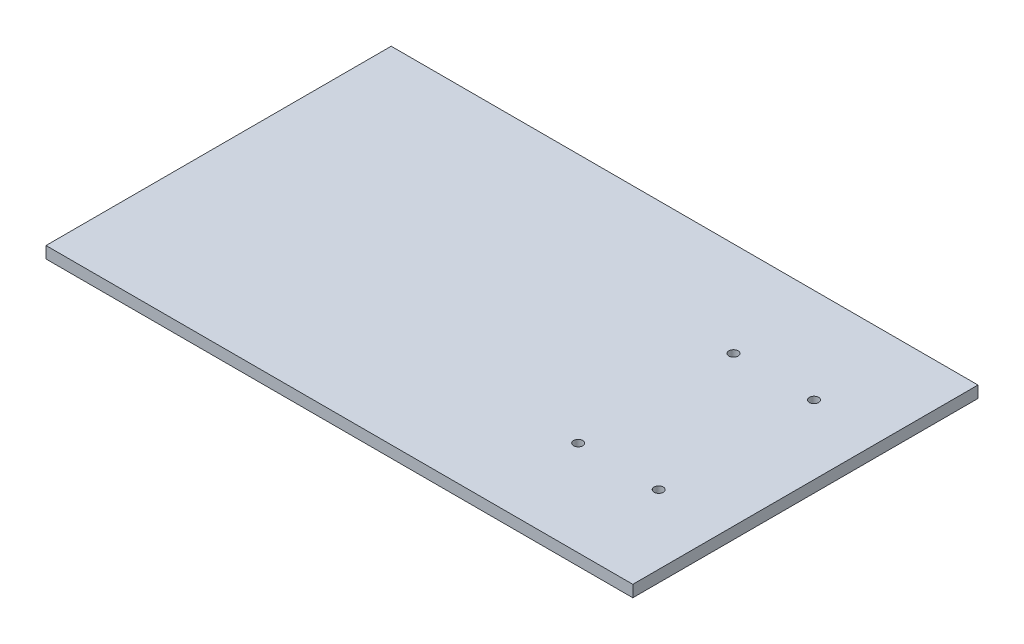
ISO-10303-21;
HEADER;
FILE_DESCRIPTION(('STEP AP214'),'2;1');
FILE_NAME('part.step','',(''),(''),'','','');
FILE_SCHEMA(('AUTOMOTIVE_DESIGN { 1 0 10303 214 1 1 1 1 }'));
ENDSEC;
DATA;
#1=APPLICATION_CONTEXT('core data for automotive mechanical design processes');
#2=APPLICATION_PROTOCOL_DEFINITION('international standard','automotive_design',2000,#1);
#3=PRODUCT_CONTEXT('',#1,'mechanical');
#4=PRODUCT('Part','Part','',(#3));
#5=PRODUCT_RELATED_PRODUCT_CATEGORY('part','',(#4));
#6=PRODUCT_DEFINITION_FORMATION('','',#4);
#7=PRODUCT_DEFINITION_CONTEXT('part definition',#1,'design');
#8=PRODUCT_DEFINITION('design','',#6,#7);
#9=PRODUCT_DEFINITION_SHAPE('','',#8);
#10=(LENGTH_UNIT() NAMED_UNIT(*) SI_UNIT(.MILLI.,.METRE.));
#11=(NAMED_UNIT(*) PLANE_ANGLE_UNIT() SI_UNIT($,.RADIAN.));
#12=(NAMED_UNIT(*) SI_UNIT($,.STERADIAN.) SOLID_ANGLE_UNIT());
#13=UNCERTAINTY_MEASURE_WITH_UNIT(LENGTH_MEASURE(1.E-05),#10,'distance_accuracy_value','');
#14=(GEOMETRIC_REPRESENTATION_CONTEXT(3) GLOBAL_UNCERTAINTY_ASSIGNED_CONTEXT((#13)) GLOBAL_UNIT_ASSIGNED_CONTEXT((#10,
#11,#12)) REPRESENTATION_CONTEXT('',''));
#15=CARTESIAN_POINT('',(0.,0.,0.));
#16=DIRECTION('',(0.,0.,1.));
#17=DIRECTION('',(1.,0.,0.));
#18=AXIS2_PLACEMENT_3D('',#15,#16,#17);
#19=CARTESIAN_POINT('',(0.,10.16,0.));
#20=DIRECTION('',(1.,0.,0.));
#21=DIRECTION('',(0.,0.,-1.));
#22=AXIS2_PLACEMENT_3D('',#19,#20,#21);
#23=PLANE('',#22);
#24=DIRECTION('',(0.,0.,1.));
#25=VECTOR('',#24,1.);
#26=CARTESIAN_POINT('',(0.,0.,0.));
#27=LINE('',#26,#25);
#28=CARTESIAN_POINT('',(0.,0.,-300.));
#29=VERTEX_POINT('',#28);
#30=CARTESIAN_POINT('',(0.,0.,0.));
#31=VERTEX_POINT('',#30);
#32=EDGE_CURVE('E110',#29,#31,#27,.T.);
#33=ORIENTED_EDGE('',*,*,#32,.T.);
#34=DIRECTION('',(0.,-1.,0.));
#35=VECTOR('',#34,1.);
#36=CARTESIAN_POINT('',(0.,10.16,0.));
#37=LINE('',#36,#35);
#38=CARTESIAN_POINT('',(0.,10.16,0.));
#39=VERTEX_POINT('',#38);
#40=EDGE_CURVE('E11',#39,#31,#37,.T.);
#41=ORIENTED_EDGE('',*,*,#40,.F.);
#42=DIRECTION('',(0.,0.,1.));
#43=VECTOR('',#42,1.);
#44=CARTESIAN_POINT('',(0.,10.16,0.));
#45=LINE('',#44,#43);
#46=CARTESIAN_POINT('',(0.,10.16,-300.));
#47=VERTEX_POINT('',#46);
#48=EDGE_CURVE('E94',#47,#39,#45,.T.);
#49=ORIENTED_EDGE('',*,*,#48,.F.);
#50=DIRECTION('',(0.,-1.,0.));
#51=VECTOR('',#50,1.);
#52=CARTESIAN_POINT('',(0.,10.16,-300.));
#53=LINE('',#52,#51);
#54=EDGE_CURVE('E106',#47,#29,#53,.T.);
#55=ORIENTED_EDGE('',*,*,#54,.T.);
#56=EDGE_LOOP('',(#33,#41,#49,#55));
#57=FACE_BOUND('',#56,.T.);
#58=ADVANCED_FACE('F42',(#57),#23,.F.);
#59=CARTESIAN_POINT('',(0.,10.16,0.));
#60=DIRECTION('',(0.,0.,-1.));
#61=DIRECTION('',(-1.,0.,0.));
#62=AXIS2_PLACEMENT_3D('',#59,#60,#61);
#63=PLANE('',#62);
#64=DIRECTION('',(1.,0.,0.));
#65=VECTOR('',#64,1.);
#66=CARTESIAN_POINT('',(0.,0.,0.));
#67=LINE('',#66,#65);
#68=CARTESIAN_POINT('',(510.,0.,0.));
#69=VERTEX_POINT('',#68);
#70=EDGE_CURVE('E99',#31,#69,#67,.T.);
#71=ORIENTED_EDGE('',*,*,#70,.T.);
#72=DIRECTION('',(0.,-1.,0.));
#73=VECTOR('',#72,1.);
#74=CARTESIAN_POINT('',(510.,10.16,0.));
#75=LINE('',#74,#73);
#76=CARTESIAN_POINT('',(510.,10.16,0.));
#77=VERTEX_POINT('',#76);
#78=EDGE_CURVE('E51',#77,#69,#75,.T.);
#79=ORIENTED_EDGE('',*,*,#78,.F.);
#80=DIRECTION('',(1.,0.,0.));
#81=VECTOR('',#80,1.);
#82=CARTESIAN_POINT('',(0.,10.16,0.));
#83=LINE('',#82,#81);
#84=EDGE_CURVE('E89',#39,#77,#83,.T.);
#85=ORIENTED_EDGE('',*,*,#84,.F.);
#86=ORIENTED_EDGE('',*,*,#40,.T.);
#87=EDGE_LOOP('',(#71,#79,#85,#86));
#88=FACE_BOUND('',#87,.T.);
#89=ADVANCED_FACE('F98',(#88),#63,.F.);
#90=CARTESIAN_POINT('',(510.,10.16,0.));
#91=DIRECTION('',(-1.,0.,0.));
#92=DIRECTION('',(0.,0.,1.));
#93=AXIS2_PLACEMENT_3D('',#90,#91,#92);
#94=PLANE('',#93);
#95=DIRECTION('',(0.,0.,-1.));
#96=VECTOR('',#95,1.);
#97=CARTESIAN_POINT('',(510.,0.,0.));
#98=LINE('',#97,#96);
#99=CARTESIAN_POINT('',(510.,0.,-300.));
#100=VERTEX_POINT('',#99);
#101=EDGE_CURVE('E76',#69,#100,#98,.T.);
#102=ORIENTED_EDGE('',*,*,#101,.T.);
#103=DIRECTION('',(0.,-1.,0.));
#104=VECTOR('',#103,1.);
#105=CARTESIAN_POINT('',(510.,10.16,-300.));
#106=LINE('',#105,#104);
#107=CARTESIAN_POINT('',(510.,10.16,-300.));
#108=VERTEX_POINT('',#107);
#109=EDGE_CURVE('E101',#108,#100,#106,.T.);
#110=ORIENTED_EDGE('',*,*,#109,.F.);
#111=DIRECTION('',(0.,0.,-1.));
#112=VECTOR('',#111,1.);
#113=CARTESIAN_POINT('',(510.,10.16,0.));
#114=LINE('',#113,#112);
#115=EDGE_CURVE('E92',#77,#108,#114,.T.);
#116=ORIENTED_EDGE('',*,*,#115,.F.);
#117=ORIENTED_EDGE('',*,*,#78,.T.);
#118=EDGE_LOOP('',(#102,#110,#116,#117));
#119=FACE_BOUND('',#118,.T.);
#120=ADVANCED_FACE('F102',(#119),#94,.F.);
#121=CARTESIAN_POINT('',(0.,10.16,-300.));
#122=DIRECTION('',(0.,0.,1.));
#123=DIRECTION('',(1.,0.,0.));
#124=AXIS2_PLACEMENT_3D('',#121,#122,#123);
#125=PLANE('',#124);
#126=DIRECTION('',(-1.,0.,0.));
#127=VECTOR('',#126,1.);
#128=CARTESIAN_POINT('',(0.,0.,-300.));
#129=LINE('',#128,#127);
#130=EDGE_CURVE('E82',#100,#29,#129,.T.);
#131=ORIENTED_EDGE('',*,*,#130,.T.);
#132=ORIENTED_EDGE('',*,*,#54,.F.);
#133=DIRECTION('',(-1.,0.,0.));
#134=VECTOR('',#133,1.);
#135=CARTESIAN_POINT('',(0.,10.16,-300.));
#136=LINE('',#135,#134);
#137=EDGE_CURVE('E59',#108,#47,#136,.T.);
#138=ORIENTED_EDGE('',*,*,#137,.F.);
#139=ORIENTED_EDGE('',*,*,#109,.T.);
#140=EDGE_LOOP('',(#131,#132,#138,#139));
#141=FACE_BOUND('',#140,.T.);
#142=ADVANCED_FACE('F124',(#141),#125,.F.);
#143=CARTESIAN_POINT('',(0.,10.16,0.));
#144=DIRECTION('',(0.,-1.,0.));
#145=DIRECTION('',(0.,0.,-1.));
#146=AXIS2_PLACEMENT_3D('',#143,#144,#145);
#147=PLANE('',#146);
#148=CARTESIAN_POINT('',(450.,10.16,-217.5));
#149=DIRECTION('',(0.,-1.,0.));
#150=DIRECTION('',(0.,0.,-1.));
#151=AXIS2_PLACEMENT_3D('',#148,#149,#150);
#152=CIRCLE('',#151,3.99999999999999);
#153=CARTESIAN_POINT('',(450.,10.16,-221.5));
#154=VERTEX_POINT('',#153);
#155=EDGE_CURVE('E139',#154,#154,#152,.T.);
#156=ORIENTED_EDGE('',*,*,#155,.T.);
#157=EDGE_LOOP('',(#156));
#158=FACE_BOUND('',#157,.T.);
#159=CARTESIAN_POINT('',(450.,10.16,-82.5));
#160=DIRECTION('',(0.,-1.,0.));
#161=DIRECTION('',(0.,0.,-1.));
#162=AXIS2_PLACEMENT_3D('',#159,#160,#161);
#163=CIRCLE('',#162,3.99999999999999);
#164=CARTESIAN_POINT('',(450.,10.16,-86.5));
#165=VERTEX_POINT('',#164);
#166=EDGE_CURVE('E147',#165,#165,#163,.T.);
#167=ORIENTED_EDGE('',*,*,#166,.T.);
#168=EDGE_LOOP('',(#167));
#169=FACE_BOUND('',#168,.T.);
#170=CARTESIAN_POINT('',(380.,10.16,-82.5000000000002));
#171=DIRECTION('',(0.,-1.,0.));
#172=DIRECTION('',(0.,0.,-1.));
#173=AXIS2_PLACEMENT_3D('',#170,#171,#172);
#174=CIRCLE('',#173,3.99999999999999);
#175=CARTESIAN_POINT('',(380.,10.16,-86.5000000000002));
#176=VERTEX_POINT('',#175);
#177=EDGE_CURVE('E155',#176,#176,#174,.T.);
#178=ORIENTED_EDGE('',*,*,#177,.T.);
#179=EDGE_LOOP('',(#178));
#180=FACE_BOUND('',#179,.T.);
#181=CARTESIAN_POINT('',(380.,10.16,-217.5));
#182=DIRECTION('',(0.,-1.,0.));
#183=DIRECTION('',(0.,0.,-1.));
#184=AXIS2_PLACEMENT_3D('',#181,#182,#183);
#185=CIRCLE('',#184,3.99999999999999);
#186=CARTESIAN_POINT('',(380.,10.16,-221.5));
#187=VERTEX_POINT('',#186);
#188=EDGE_CURVE('E114',#187,#187,#185,.T.);
#189=ORIENTED_EDGE('',*,*,#188,.T.);
#190=EDGE_LOOP('',(#189));
#191=FACE_BOUND('',#190,.T.);
#192=ORIENTED_EDGE('',*,*,#48,.T.);
#193=ORIENTED_EDGE('',*,*,#84,.T.);
#194=ORIENTED_EDGE('',*,*,#115,.T.);
#195=ORIENTED_EDGE('',*,*,#137,.T.);
#196=EDGE_LOOP('',(#192,#193,#194,#195));
#197=FACE_BOUND('',#196,.T.);
#198=ADVANCED_FACE('F90',(#158,#169,#180,#191,#197),#147,.F.);
#199=CARTESIAN_POINT('',(0.,0.,0.));
#200=DIRECTION('',(0.,-1.,0.));
#201=DIRECTION('',(0.,0.,-1.));
#202=AXIS2_PLACEMENT_3D('',#199,#200,#201);
#203=PLANE('',#202);
#204=CARTESIAN_POINT('',(450.,0.,-217.5));
#205=DIRECTION('',(0.,-1.,0.));
#206=DIRECTION('',(0.,0.,-1.));
#207=AXIS2_PLACEMENT_3D('',#204,#205,#206);
#208=CIRCLE('',#207,3.99999999999999);
#209=CARTESIAN_POINT('',(450.,0.,-221.5));
#210=VERTEX_POINT('',#209);
#211=EDGE_CURVE('E143',#210,#210,#208,.T.);
#212=ORIENTED_EDGE('',*,*,#211,.F.);
#213=EDGE_LOOP('',(#212));
#214=FACE_BOUND('',#213,.T.);
#215=CARTESIAN_POINT('',(450.,0.,-82.5));
#216=DIRECTION('',(0.,-1.,0.));
#217=DIRECTION('',(0.,0.,-1.));
#218=AXIS2_PLACEMENT_3D('',#215,#216,#217);
#219=CIRCLE('',#218,3.99999999999999);
#220=CARTESIAN_POINT('',(450.,0.,-86.5));
#221=VERTEX_POINT('',#220);
#222=EDGE_CURVE('E151',#221,#221,#219,.T.);
#223=ORIENTED_EDGE('',*,*,#222,.F.);
#224=EDGE_LOOP('',(#223));
#225=FACE_BOUND('',#224,.T.);
#226=CARTESIAN_POINT('',(380.,0.,-82.5000000000002));
#227=DIRECTION('',(0.,-1.,0.));
#228=DIRECTION('',(0.,0.,-1.));
#229=AXIS2_PLACEMENT_3D('',#226,#227,#228);
#230=CIRCLE('',#229,3.99999999999999);
#231=CARTESIAN_POINT('',(380.,0.,-86.5000000000002));
#232=VERTEX_POINT('',#231);
#233=EDGE_CURVE('E135',#232,#232,#230,.T.);
#234=ORIENTED_EDGE('',*,*,#233,.F.);
#235=EDGE_LOOP('',(#234));
#236=FACE_BOUND('',#235,.T.);
#237=CARTESIAN_POINT('',(380.,0.,-217.5));
#238=DIRECTION('',(0.,-1.,0.));
#239=DIRECTION('',(0.,0.,-1.));
#240=AXIS2_PLACEMENT_3D('',#237,#238,#239);
#241=CIRCLE('',#240,3.99999999999999);
#242=CARTESIAN_POINT('',(380.,0.,-221.5));
#243=VERTEX_POINT('',#242);
#244=EDGE_CURVE('E131',#243,#243,#241,.T.);
#245=ORIENTED_EDGE('',*,*,#244,.F.);
#246=EDGE_LOOP('',(#245));
#247=FACE_BOUND('',#246,.T.);
#248=ORIENTED_EDGE('',*,*,#32,.F.);
#249=ORIENTED_EDGE('',*,*,#130,.F.);
#250=ORIENTED_EDGE('',*,*,#101,.F.);
#251=ORIENTED_EDGE('',*,*,#70,.F.);
#252=EDGE_LOOP('',(#248,#249,#250,#251));
#253=FACE_BOUND('',#252,.T.);
#254=ADVANCED_FACE('F127',(#214,#225,#236,#247,#253),#203,.T.);
#255=CARTESIAN_POINT('',(380.,10.16,-217.5));
#256=DIRECTION('',(0.,-1.,0.));
#257=DIRECTION('',(0.,0.,-1.));
#258=AXIS2_PLACEMENT_3D('',#255,#256,#257);
#259=CYLINDRICAL_SURFACE('',#258,3.99999999999999);
#260=ORIENTED_EDGE('',*,*,#188,.F.);
#261=EDGE_LOOP('',(#260));
#262=FACE_BOUND('',#261,.T.);
#263=ORIENTED_EDGE('',*,*,#244,.T.);
#264=EDGE_LOOP('',(#263));
#265=FACE_BOUND('',#264,.T.);
#266=ADVANCED_FACE('F167',(#262,#265),#259,.F.);
#267=CARTESIAN_POINT('',(380.,10.16,-82.5000000000002));
#268=DIRECTION('',(0.,-1.,0.));
#269=DIRECTION('',(0.,0.,-1.));
#270=AXIS2_PLACEMENT_3D('',#267,#268,#269);
#271=CYLINDRICAL_SURFACE('',#270,3.99999999999999);
#272=ORIENTED_EDGE('',*,*,#177,.F.);
#273=EDGE_LOOP('',(#272));
#274=FACE_BOUND('',#273,.T.);
#275=ORIENTED_EDGE('',*,*,#233,.T.);
#276=EDGE_LOOP('',(#275));
#277=FACE_BOUND('',#276,.T.);
#278=ADVANCED_FACE('F163',(#274,#277),#271,.F.);
#279=CARTESIAN_POINT('',(450.,10.16,-82.5));
#280=DIRECTION('',(0.,-1.,0.));
#281=DIRECTION('',(0.,0.,-1.));
#282=AXIS2_PLACEMENT_3D('',#279,#280,#281);
#283=CYLINDRICAL_SURFACE('',#282,3.99999999999999);
#284=ORIENTED_EDGE('',*,*,#166,.F.);
#285=EDGE_LOOP('',(#284));
#286=FACE_BOUND('',#285,.T.);
#287=ORIENTED_EDGE('',*,*,#222,.T.);
#288=EDGE_LOOP('',(#287));
#289=FACE_BOUND('',#288,.T.);
#290=ADVANCED_FACE('F179',(#286,#289),#283,.F.);
#291=CARTESIAN_POINT('',(450.,10.16,-217.5));
#292=DIRECTION('',(0.,-1.,0.));
#293=DIRECTION('',(0.,0.,-1.));
#294=AXIS2_PLACEMENT_3D('',#291,#292,#293);
#295=CYLINDRICAL_SURFACE('',#294,3.99999999999999);
#296=ORIENTED_EDGE('',*,*,#155,.F.);
#297=EDGE_LOOP('',(#296));
#298=FACE_BOUND('',#297,.T.);
#299=ORIENTED_EDGE('',*,*,#211,.T.);
#300=EDGE_LOOP('',(#299));
#301=FACE_BOUND('',#300,.T.);
#302=ADVANCED_FACE('F209',(#298,#301),#295,.F.);
#303=CLOSED_SHELL('',(#58,#89,#120,#142,#198,#254,#266,#278,#290,#302));
#304=MANIFOLD_SOLID_BREP('B2',#303);
#305=ADVANCED_BREP_SHAPE_REPRESENTATION('',(#18,#304),#14);
#306=SHAPE_DEFINITION_REPRESENTATION(#9,#305);
ENDSEC;
END-ISO-10303-21;
